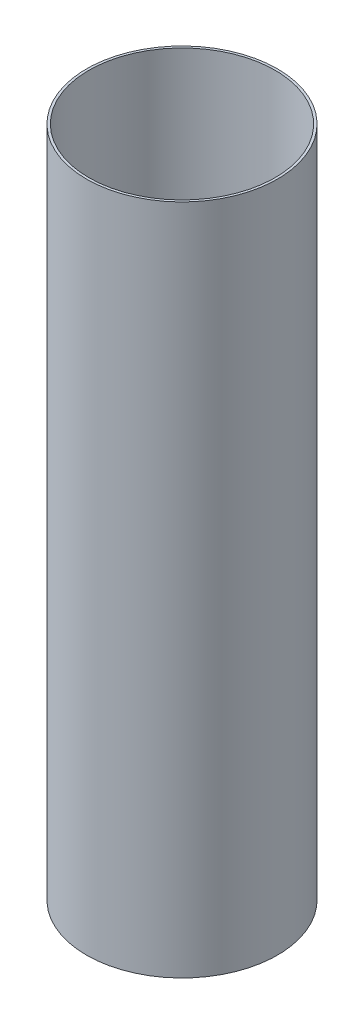
ISO-10303-21;
HEADER;
FILE_DESCRIPTION(('STEP AP214'),'2;1');
FILE_NAME('part.step','',(''),(''),'','','');
FILE_SCHEMA(('AUTOMOTIVE_DESIGN { 1 0 10303 214 1 1 1 1 }'));
ENDSEC;
DATA;
#1=APPLICATION_CONTEXT('core data for automotive mechanical design processes');
#2=APPLICATION_PROTOCOL_DEFINITION('international standard','automotive_design',2000,#1);
#3=PRODUCT_CONTEXT('',#1,'mechanical');
#4=PRODUCT('Part','Part','',(#3));
#5=PRODUCT_RELATED_PRODUCT_CATEGORY('part','',(#4));
#6=PRODUCT_DEFINITION_FORMATION('','',#4);
#7=PRODUCT_DEFINITION_CONTEXT('part definition',#1,'design');
#8=PRODUCT_DEFINITION('design','',#6,#7);
#9=PRODUCT_DEFINITION_SHAPE('','',#8);
#10=(LENGTH_UNIT() NAMED_UNIT(*) SI_UNIT(.MILLI.,.METRE.));
#11=(NAMED_UNIT(*) PLANE_ANGLE_UNIT() SI_UNIT($,.RADIAN.));
#12=(NAMED_UNIT(*) SI_UNIT($,.STERADIAN.) SOLID_ANGLE_UNIT());
#13=UNCERTAINTY_MEASURE_WITH_UNIT(LENGTH_MEASURE(1.E-05),#10,'distance_accuracy_value','');
#14=(GEOMETRIC_REPRESENTATION_CONTEXT(3) GLOBAL_UNCERTAINTY_ASSIGNED_CONTEXT((#13)) GLOBAL_UNIT_ASSIGNED_CONTEXT((#10,
#11,#12)) REPRESENTATION_CONTEXT('',''));
#15=CARTESIAN_POINT('',(0.,0.,0.));
#16=DIRECTION('',(0.,0.,1.));
#17=DIRECTION('',(1.,0.,0.));
#18=AXIS2_PLACEMENT_3D('',#15,#16,#17);
#19=CARTESIAN_POINT('',(76.2,0.,0.));
#20=DIRECTION('',(0.,1.,0.));
#21=DIRECTION('',(0.,0.,1.));
#22=AXIS2_PLACEMENT_3D('',#19,#20,#21);
#23=PLANE('',#22);
#24=CARTESIAN_POINT('',(0.,0.,0.));
#25=DIRECTION('',(0.,1.,0.));
#26=DIRECTION('',(0.,0.,1.));
#27=AXIS2_PLACEMENT_3D('',#24,#25,#26);
#28=CIRCLE('',#27,78.16);
#29=CARTESIAN_POINT('',(0.,0.,78.16));
#30=VERTEX_POINT('',#29);
#31=EDGE_CURVE('E10',#30,#30,#28,.T.);
#32=ORIENTED_EDGE('',*,*,#31,.F.);
#33=EDGE_LOOP('',(#32));
#34=FACE_BOUND('',#33,.T.);
#35=CARTESIAN_POINT('',(0.,0.,0.));
#36=DIRECTION('',(0.,1.,0.));
#37=DIRECTION('',(0.,0.,1.));
#38=AXIS2_PLACEMENT_3D('',#35,#36,#37);
#39=CIRCLE('',#38,76.2);
#40=CARTESIAN_POINT('',(0.,0.,76.2));
#41=VERTEX_POINT('',#40);
#42=EDGE_CURVE('E54',#41,#41,#39,.T.);
#43=ORIENTED_EDGE('',*,*,#42,.T.);
#44=EDGE_LOOP('',(#43));
#45=FACE_BOUND('',#44,.T.);
#46=ADVANCED_FACE('F37',(#34,#45),#23,.F.);
#47=CARTESIAN_POINT('',(0.,204.615384615384,0.));
#48=DIRECTION('',(0.,1.,0.));
#49=DIRECTION('',(0.,0.,1.));
#50=AXIS2_PLACEMENT_3D('',#47,#48,#49);
#51=CYLINDRICAL_SURFACE('',#50,78.16);
#52=CARTESIAN_POINT('',(0.,550.,0.));
#53=DIRECTION('',(0.,1.,0.));
#54=DIRECTION('',(0.,0.,1.));
#55=AXIS2_PLACEMENT_3D('',#52,#53,#54);
#56=CIRCLE('',#55,78.16);
#57=CARTESIAN_POINT('',(0.,550.,78.16));
#58=VERTEX_POINT('',#57);
#59=EDGE_CURVE('E44',#58,#58,#56,.T.);
#60=ORIENTED_EDGE('',*,*,#59,.F.);
#61=EDGE_LOOP('',(#60));
#62=FACE_BOUND('',#61,.T.);
#63=ORIENTED_EDGE('',*,*,#31,.T.);
#64=EDGE_LOOP('',(#63));
#65=FACE_BOUND('',#64,.T.);
#66=ADVANCED_FACE('F70',(#62,#65),#51,.T.);
#67=CARTESIAN_POINT('',(78.16,550.,0.));
#68=DIRECTION('',(0.,-1.,0.));
#69=DIRECTION('',(0.,0.,-1.));
#70=AXIS2_PLACEMENT_3D('',#67,#68,#69);
#71=PLANE('',#70);
#72=CARTESIAN_POINT('',(0.,550.,0.));
#73=DIRECTION('',(0.,1.,0.));
#74=DIRECTION('',(0.,0.,1.));
#75=AXIS2_PLACEMENT_3D('',#72,#73,#74);
#76=CIRCLE('',#75,76.2);
#77=CARTESIAN_POINT('',(0.,550.,76.2));
#78=VERTEX_POINT('',#77);
#79=EDGE_CURVE('E49',#78,#78,#76,.T.);
#80=ORIENTED_EDGE('',*,*,#79,.F.);
#81=EDGE_LOOP('',(#80));
#82=FACE_BOUND('',#81,.T.);
#83=ORIENTED_EDGE('',*,*,#59,.T.);
#84=EDGE_LOOP('',(#83));
#85=FACE_BOUND('',#84,.T.);
#86=ADVANCED_FACE('F65',(#82,#85),#71,.F.);
#87=CARTESIAN_POINT('',(0.,204.615384615384,0.));
#88=DIRECTION('',(0.,1.,0.));
#89=DIRECTION('',(0.,0.,1.));
#90=AXIS2_PLACEMENT_3D('',#87,#88,#89);
#91=CYLINDRICAL_SURFACE('',#90,76.2);
#92=ORIENTED_EDGE('',*,*,#42,.F.);
#93=EDGE_LOOP('',(#92));
#94=FACE_BOUND('',#93,.T.);
#95=ORIENTED_EDGE('',*,*,#79,.T.);
#96=EDGE_LOOP('',(#95));
#97=FACE_BOUND('',#96,.T.);
#98=ADVANCED_FACE('F62',(#94,#97),#91,.F.);
#99=CLOSED_SHELL('',(#46,#66,#86,#98));
#100=MANIFOLD_SOLID_BREP('B2',#99);
#101=ADVANCED_BREP_SHAPE_REPRESENTATION('',(#18,#100),#14);
#102=SHAPE_DEFINITION_REPRESENTATION(#9,#101);
ENDSEC;
END-ISO-10303-21;
